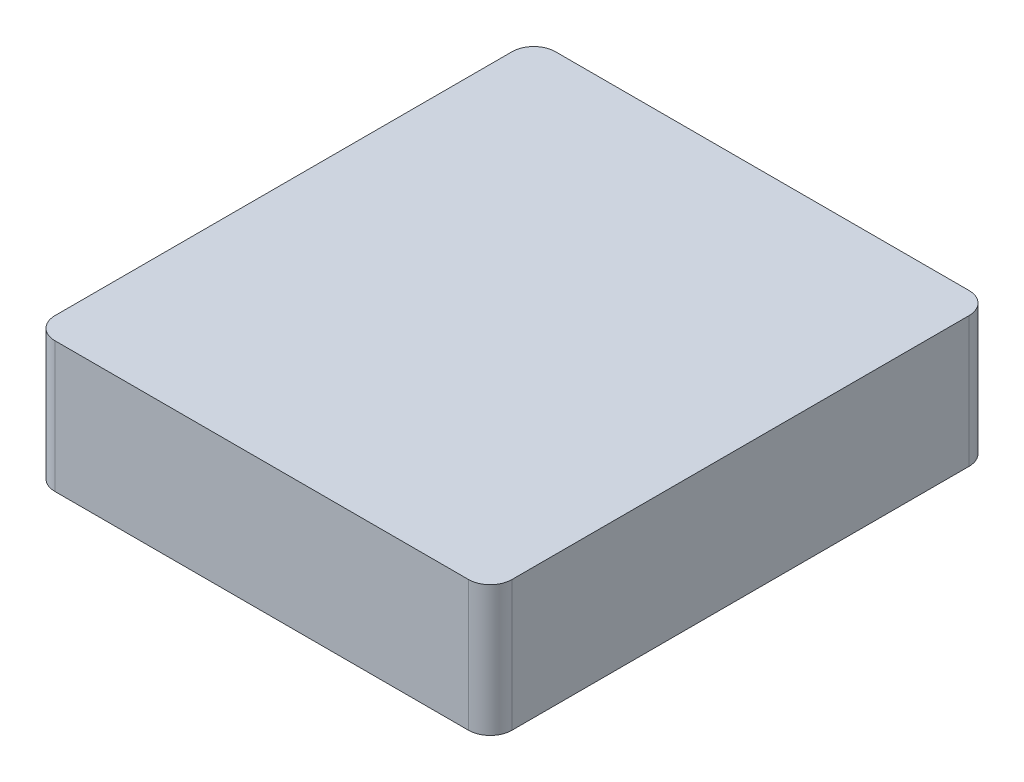
ISO-10303-21;
HEADER;
FILE_DESCRIPTION(('STEP AP214'),'2;1');
FILE_NAME('part.step','',(''),(''),'','','');
FILE_SCHEMA(('AUTOMOTIVE_DESIGN { 1 0 10303 214 1 1 1 1 }'));
ENDSEC;
DATA;
#1=APPLICATION_CONTEXT('core data for automotive mechanical design processes');
#2=APPLICATION_PROTOCOL_DEFINITION('international standard','automotive_design',2000,#1);
#3=PRODUCT_CONTEXT('',#1,'mechanical');
#4=PRODUCT('Part','Part','',(#3));
#5=PRODUCT_RELATED_PRODUCT_CATEGORY('part','',(#4));
#6=PRODUCT_DEFINITION_FORMATION('','',#4);
#7=PRODUCT_DEFINITION_CONTEXT('part definition',#1,'design');
#8=PRODUCT_DEFINITION('design','',#6,#7);
#9=PRODUCT_DEFINITION_SHAPE('','',#8);
#10=(LENGTH_UNIT() NAMED_UNIT(*) SI_UNIT(.MILLI.,.METRE.));
#11=(NAMED_UNIT(*) PLANE_ANGLE_UNIT() SI_UNIT($,.RADIAN.));
#12=(NAMED_UNIT(*) SI_UNIT($,.STERADIAN.) SOLID_ANGLE_UNIT());
#13=UNCERTAINTY_MEASURE_WITH_UNIT(LENGTH_MEASURE(1.E-05),#10,'distance_accuracy_value','');
#14=(GEOMETRIC_REPRESENTATION_CONTEXT(3) GLOBAL_UNCERTAINTY_ASSIGNED_CONTEXT((#13)) GLOBAL_UNIT_ASSIGNED_CONTEXT((#10,
#11,#12)) REPRESENTATION_CONTEXT('',''));
#15=CARTESIAN_POINT('',(0.,0.,0.));
#16=DIRECTION('',(0.,0.,1.));
#17=DIRECTION('',(1.,0.,0.));
#18=AXIS2_PLACEMENT_3D('',#15,#16,#17);
#19=CARTESIAN_POINT('',(10.5,6.,-11.5));
#20=DIRECTION('',(-1.,0.,0.));
#21=DIRECTION('',(0.,0.,1.));
#22=AXIS2_PLACEMENT_3D('',#19,#20,#21);
#23=PLANE('',#22);
#24=DIRECTION('',(0.,0.,-1.));
#25=VECTOR('',#24,1.);
#26=CARTESIAN_POINT('',(10.5,0.,-11.5));
#27=LINE('',#26,#25);
#28=CARTESIAN_POINT('',(10.5,0.,10.5));
#29=VERTEX_POINT('',#28);
#30=CARTESIAN_POINT('',(10.5,0.,-10.5));
#31=VERTEX_POINT('',#30);
#32=EDGE_CURVE('E140',#29,#31,#27,.T.);
#33=ORIENTED_EDGE('',*,*,#32,.T.);
#34=DIRECTION('',(0.,-1.,0.));
#35=VECTOR('',#34,1.);
#36=CARTESIAN_POINT('',(10.5,6.,-10.5));
#37=LINE('',#36,#35);
#38=CARTESIAN_POINT('',(10.5,6.,-10.5));
#39=VERTEX_POINT('',#38);
#40=EDGE_CURVE('E174',#31,#39,#37,.F.);
#41=ORIENTED_EDGE('',*,*,#40,.T.);
#42=DIRECTION('',(0.,0.,-1.));
#43=VECTOR('',#42,1.);
#44=CARTESIAN_POINT('',(10.5,6.,-11.5));
#45=LINE('',#44,#43);
#46=CARTESIAN_POINT('',(10.5,6.,10.5));
#47=VERTEX_POINT('',#46);
#48=EDGE_CURVE('E138',#47,#39,#45,.T.);
#49=ORIENTED_EDGE('',*,*,#48,.F.);
#50=DIRECTION('',(0.,-1.,0.));
#51=VECTOR('',#50,1.);
#52=CARTESIAN_POINT('',(10.5,6.,10.5));
#53=LINE('',#52,#51);
#54=EDGE_CURVE('E170',#47,#29,#53,.T.);
#55=ORIENTED_EDGE('',*,*,#54,.T.);
#56=EDGE_LOOP('',(#33,#41,#49,#55));
#57=FACE_BOUND('',#56,.T.);
#58=ADVANCED_FACE('F39',(#57),#23,.F.);
#59=CARTESIAN_POINT('',(-10.5,6.,-11.5));
#60=DIRECTION('',(0.,0.,1.));
#61=DIRECTION('',(1.,0.,0.));
#62=AXIS2_PLACEMENT_3D('',#59,#60,#61);
#63=PLANE('',#62);
#64=DIRECTION('',(-1.,0.,0.));
#65=VECTOR('',#64,1.);
#66=CARTESIAN_POINT('',(-10.5,0.,-11.5));
#67=LINE('',#66,#65);
#68=CARTESIAN_POINT('',(9.49999999999999,0.,-11.5));
#69=VERTEX_POINT('',#68);
#70=CARTESIAN_POINT('',(-9.50000000000001,0.,-11.5));
#71=VERTEX_POINT('',#70);
#72=EDGE_CURVE('E134',#69,#71,#67,.T.);
#73=ORIENTED_EDGE('',*,*,#72,.T.);
#74=DIRECTION('',(0.,-1.,0.));
#75=VECTOR('',#74,1.);
#76=CARTESIAN_POINT('',(-9.50000000000001,6.,-11.5));
#77=LINE('',#76,#75);
#78=CARTESIAN_POINT('',(-9.50000000000001,6.,-11.5));
#79=VERTEX_POINT('',#78);
#80=EDGE_CURVE('E110',#71,#79,#77,.F.);
#81=ORIENTED_EDGE('',*,*,#80,.T.);
#82=DIRECTION('',(-1.,0.,0.));
#83=VECTOR('',#82,1.);
#84=CARTESIAN_POINT('',(-10.5,6.,-11.5));
#85=LINE('',#84,#83);
#86=CARTESIAN_POINT('',(9.49999999999999,6.,-11.5));
#87=VERTEX_POINT('',#86);
#88=EDGE_CURVE('E193',#87,#79,#85,.T.);
#89=ORIENTED_EDGE('',*,*,#88,.F.);
#90=DIRECTION('',(0.,-1.,0.));
#91=VECTOR('',#90,1.);
#92=CARTESIAN_POINT('',(9.49999999999999,6.,-11.5));
#93=LINE('',#92,#91);
#94=EDGE_CURVE('E116',#87,#69,#93,.T.);
#95=ORIENTED_EDGE('',*,*,#94,.T.);
#96=EDGE_LOOP('',(#73,#81,#89,#95));
#97=FACE_BOUND('',#96,.T.);
#98=ADVANCED_FACE('F214',(#97),#63,.F.);
#99=CARTESIAN_POINT('',(-10.5,6.,-11.5));
#100=DIRECTION('',(1.,0.,0.));
#101=DIRECTION('',(0.,0.,-1.));
#102=AXIS2_PLACEMENT_3D('',#99,#100,#101);
#103=PLANE('',#102);
#104=DIRECTION('',(0.,0.,1.));
#105=VECTOR('',#104,1.);
#106=CARTESIAN_POINT('',(-10.5,6.,-11.5));
#107=LINE('',#106,#105);
#108=CARTESIAN_POINT('',(-10.5,6.,-10.5));
#109=VERTEX_POINT('',#108);
#110=CARTESIAN_POINT('',(-10.5,6.,10.5));
#111=VERTEX_POINT('',#110);
#112=EDGE_CURVE('E125',#109,#111,#107,.T.);
#113=ORIENTED_EDGE('',*,*,#112,.F.);
#114=DIRECTION('',(0.,-1.,0.));
#115=VECTOR('',#114,1.);
#116=CARTESIAN_POINT('',(-10.5,6.,-10.5));
#117=LINE('',#116,#115);
#118=CARTESIAN_POINT('',(-10.5,0.,-10.5));
#119=VERTEX_POINT('',#118);
#120=EDGE_CURVE('E109',#109,#119,#117,.T.);
#121=ORIENTED_EDGE('',*,*,#120,.T.);
#122=DIRECTION('',(0.,0.,1.));
#123=VECTOR('',#122,1.);
#124=CARTESIAN_POINT('',(-10.5,0.,-11.5));
#125=LINE('',#124,#123);
#126=CARTESIAN_POINT('',(-10.5,0.,10.5));
#127=VERTEX_POINT('',#126);
#128=EDGE_CURVE('E123',#119,#127,#125,.T.);
#129=ORIENTED_EDGE('',*,*,#128,.T.);
#130=DIRECTION('',(0.,-1.,0.));
#131=VECTOR('',#130,1.);
#132=CARTESIAN_POINT('',(-10.5,6.,10.5));
#133=LINE('',#132,#131);
#134=EDGE_CURVE('E128',#127,#111,#133,.F.);
#135=ORIENTED_EDGE('',*,*,#134,.T.);
#136=EDGE_LOOP('',(#113,#121,#129,#135));
#137=FACE_BOUND('',#136,.T.);
#138=ADVANCED_FACE('F122',(#137),#103,.F.);
#139=CARTESIAN_POINT('',(-10.5,6.,11.5));
#140=DIRECTION('',(0.,0.,-1.));
#141=DIRECTION('',(-1.,0.,0.));
#142=AXIS2_PLACEMENT_3D('',#139,#140,#141);
#143=PLANE('',#142);
#144=DIRECTION('',(1.,0.,0.));
#145=VECTOR('',#144,1.);
#146=CARTESIAN_POINT('',(-10.5,0.,11.5));
#147=LINE('',#146,#145);
#148=CARTESIAN_POINT('',(-9.5,0.,11.5));
#149=VERTEX_POINT('',#148);
#150=CARTESIAN_POINT('',(9.49999999999999,0.,11.5));
#151=VERTEX_POINT('',#150);
#152=EDGE_CURVE('E133',#149,#151,#147,.T.);
#153=ORIENTED_EDGE('',*,*,#152,.T.);
#154=DIRECTION('',(0.,-1.,0.));
#155=VECTOR('',#154,1.);
#156=CARTESIAN_POINT('',(9.5,6.,11.5));
#157=LINE('',#156,#155);
#158=CARTESIAN_POINT('',(9.49999999999999,6.,11.5));
#159=VERTEX_POINT('',#158);
#160=EDGE_CURVE('E11',#151,#159,#157,.F.);
#161=ORIENTED_EDGE('',*,*,#160,.T.);
#162=DIRECTION('',(1.,0.,0.));
#163=VECTOR('',#162,1.);
#164=CARTESIAN_POINT('',(-10.5,6.,11.5));
#165=LINE('',#164,#163);
#166=CARTESIAN_POINT('',(-9.5,6.,11.5));
#167=VERTEX_POINT('',#166);
#168=EDGE_CURVE('E145',#167,#159,#165,.T.);
#169=ORIENTED_EDGE('',*,*,#168,.F.);
#170=DIRECTION('',(0.,-1.,0.));
#171=VECTOR('',#170,1.);
#172=CARTESIAN_POINT('',(-9.5,6.,11.5));
#173=LINE('',#172,#171);
#174=EDGE_CURVE('E48',#167,#149,#173,.T.);
#175=ORIENTED_EDGE('',*,*,#174,.T.);
#176=EDGE_LOOP('',(#153,#161,#169,#175));
#177=FACE_BOUND('',#176,.T.);
#178=ADVANCED_FACE('F179',(#177),#143,.F.);
#179=CARTESIAN_POINT('',(0.,6.,0.));
#180=DIRECTION('',(0.,1.,0.));
#181=DIRECTION('',(0.,0.,1.));
#182=AXIS2_PLACEMENT_3D('',#179,#180,#181);
#183=PLANE('',#182);
#184=ORIENTED_EDGE('',*,*,#88,.T.);
#185=CARTESIAN_POINT('',(-9.50000000000001,6.,-10.5));
#186=DIRECTION('',(0.,1.,0.));
#187=DIRECTION('',(0.,0.,1.));
#188=AXIS2_PLACEMENT_3D('',#185,#186,#187);
#189=CIRCLE('',#188,1.);
#190=EDGE_CURVE('E167',#79,#109,#189,.T.);
#191=ORIENTED_EDGE('',*,*,#190,.T.);
#192=ORIENTED_EDGE('',*,*,#112,.T.);
#193=CARTESIAN_POINT('',(-9.5,6.,10.5));
#194=DIRECTION('',(0.,1.,0.));
#195=DIRECTION('',(0.,0.,1.));
#196=AXIS2_PLACEMENT_3D('',#193,#194,#195);
#197=CIRCLE('',#196,1.);
#198=EDGE_CURVE('E60',#111,#167,#197,.T.);
#199=ORIENTED_EDGE('',*,*,#198,.T.);
#200=ORIENTED_EDGE('',*,*,#168,.T.);
#201=CARTESIAN_POINT('',(9.5,6.,10.5));
#202=DIRECTION('',(0.,1.,0.));
#203=DIRECTION('',(0.,0.,1.));
#204=AXIS2_PLACEMENT_3D('',#201,#202,#203);
#205=CIRCLE('',#204,1.);
#206=EDGE_CURVE('E161',#159,#47,#205,.T.);
#207=ORIENTED_EDGE('',*,*,#206,.T.);
#208=ORIENTED_EDGE('',*,*,#48,.T.);
#209=CARTESIAN_POINT('',(9.49999999999999,6.,-10.5));
#210=DIRECTION('',(0.,1.,0.));
#211=DIRECTION('',(0.,0.,1.));
#212=AXIS2_PLACEMENT_3D('',#209,#210,#211);
#213=CIRCLE('',#212,1.);
#214=EDGE_CURVE('E164',#39,#87,#213,.T.);
#215=ORIENTED_EDGE('',*,*,#214,.T.);
#216=EDGE_LOOP('',(#184,#191,#192,#199,#200,#207,#208,#215));
#217=FACE_BOUND('',#216,.T.);
#218=ADVANCED_FACE('F203',(#217),#183,.T.);
#219=CARTESIAN_POINT('',(0.,0.,0.));
#220=DIRECTION('',(0.,1.,0.));
#221=DIRECTION('',(0.,0.,1.));
#222=AXIS2_PLACEMENT_3D('',#219,#220,#221);
#223=PLANE('',#222);
#224=ORIENTED_EDGE('',*,*,#128,.F.);
#225=CARTESIAN_POINT('',(-9.50000000000001,0.,-10.5));
#226=DIRECTION('',(0.,1.,0.));
#227=DIRECTION('',(0.,0.,1.));
#228=AXIS2_PLACEMENT_3D('',#225,#226,#227);
#229=CIRCLE('',#228,1.);
#230=EDGE_CURVE('E105',#119,#71,#229,.F.);
#231=ORIENTED_EDGE('',*,*,#230,.T.);
#232=ORIENTED_EDGE('',*,*,#72,.F.);
#233=CARTESIAN_POINT('',(9.49999999999999,0.,-10.5));
#234=DIRECTION('',(0.,1.,0.));
#235=DIRECTION('',(0.,0.,1.));
#236=AXIS2_PLACEMENT_3D('',#233,#234,#235);
#237=CIRCLE('',#236,1.);
#238=EDGE_CURVE('E117',#69,#31,#237,.F.);
#239=ORIENTED_EDGE('',*,*,#238,.T.);
#240=ORIENTED_EDGE('',*,*,#32,.F.);
#241=CARTESIAN_POINT('',(9.5,0.,10.5));
#242=DIRECTION('',(0.,1.,0.));
#243=DIRECTION('',(0.,0.,1.));
#244=AXIS2_PLACEMENT_3D('',#241,#242,#243);
#245=CIRCLE('',#244,1.);
#246=EDGE_CURVE('E149',#29,#151,#245,.F.);
#247=ORIENTED_EDGE('',*,*,#246,.T.);
#248=ORIENTED_EDGE('',*,*,#152,.F.);
#249=CARTESIAN_POINT('',(-9.5,0.,10.5));
#250=DIRECTION('',(0.,1.,0.));
#251=DIRECTION('',(0.,0.,1.));
#252=AXIS2_PLACEMENT_3D('',#249,#250,#251);
#253=CIRCLE('',#252,1.);
#254=EDGE_CURVE('E127',#149,#127,#253,.F.);
#255=ORIENTED_EDGE('',*,*,#254,.T.);
#256=EDGE_LOOP('',(#224,#231,#232,#239,#240,#247,#248,#255));
#257=FACE_BOUND('',#256,.T.);
#258=ADVANCED_FACE('F130',(#257),#223,.F.);
#259=CARTESIAN_POINT('',(-9.50000000000001,6.,-10.5));
#260=DIRECTION('',(0.,-1.,0.));
#261=DIRECTION('',(0.,0.,-1.));
#262=AXIS2_PLACEMENT_3D('',#259,#260,#261);
#263=CYLINDRICAL_SURFACE('',#262,1.);
#264=ORIENTED_EDGE('',*,*,#190,.F.);
#265=ORIENTED_EDGE('',*,*,#80,.F.);
#266=ORIENTED_EDGE('',*,*,#230,.F.);
#267=ORIENTED_EDGE('',*,*,#120,.F.);
#268=EDGE_LOOP('',(#264,#265,#266,#267));
#269=FACE_BOUND('',#268,.T.);
#270=ADVANCED_FACE('F108',(#269),#263,.T.);
#271=CARTESIAN_POINT('',(9.49999999999999,6.,-10.5));
#272=DIRECTION('',(0.,-1.,0.));
#273=DIRECTION('',(0.,0.,-1.));
#274=AXIS2_PLACEMENT_3D('',#271,#272,#273);
#275=CYLINDRICAL_SURFACE('',#274,1.);
#276=ORIENTED_EDGE('',*,*,#214,.F.);
#277=ORIENTED_EDGE('',*,*,#40,.F.);
#278=ORIENTED_EDGE('',*,*,#238,.F.);
#279=ORIENTED_EDGE('',*,*,#94,.F.);
#280=EDGE_LOOP('',(#276,#277,#278,#279));
#281=FACE_BOUND('',#280,.T.);
#282=ADVANCED_FACE('F225',(#281),#275,.T.);
#283=CARTESIAN_POINT('',(9.5,6.,10.5));
#284=DIRECTION('',(0.,-1.,0.));
#285=DIRECTION('',(0.,0.,-1.));
#286=AXIS2_PLACEMENT_3D('',#283,#284,#285);
#287=CYLINDRICAL_SURFACE('',#286,1.);
#288=ORIENTED_EDGE('',*,*,#206,.F.);
#289=ORIENTED_EDGE('',*,*,#160,.F.);
#290=ORIENTED_EDGE('',*,*,#246,.F.);
#291=ORIENTED_EDGE('',*,*,#54,.F.);
#292=EDGE_LOOP('',(#288,#289,#290,#291));
#293=FACE_BOUND('',#292,.T.);
#294=ADVANCED_FACE('F186',(#293),#287,.T.);
#295=CARTESIAN_POINT('',(-9.5,6.,10.5));
#296=DIRECTION('',(0.,-1.,0.));
#297=DIRECTION('',(0.,0.,-1.));
#298=AXIS2_PLACEMENT_3D('',#295,#296,#297);
#299=CYLINDRICAL_SURFACE('',#298,1.);
#300=ORIENTED_EDGE('',*,*,#198,.F.);
#301=ORIENTED_EDGE('',*,*,#134,.F.);
#302=ORIENTED_EDGE('',*,*,#254,.F.);
#303=ORIENTED_EDGE('',*,*,#174,.F.);
#304=EDGE_LOOP('',(#300,#301,#302,#303));
#305=FACE_BOUND('',#304,.T.);
#306=ADVANCED_FACE('F41',(#305),#299,.T.);
#307=CLOSED_SHELL('',(#58,#98,#138,#178,#218,#258,#270,#282,#294,#306));
#308=MANIFOLD_SOLID_BREP('B2',#307);
#309=ADVANCED_BREP_SHAPE_REPRESENTATION('',(#18,#308),#14);
#310=SHAPE_DEFINITION_REPRESENTATION(#9,#309);
ENDSEC;
END-ISO-10303-21;
